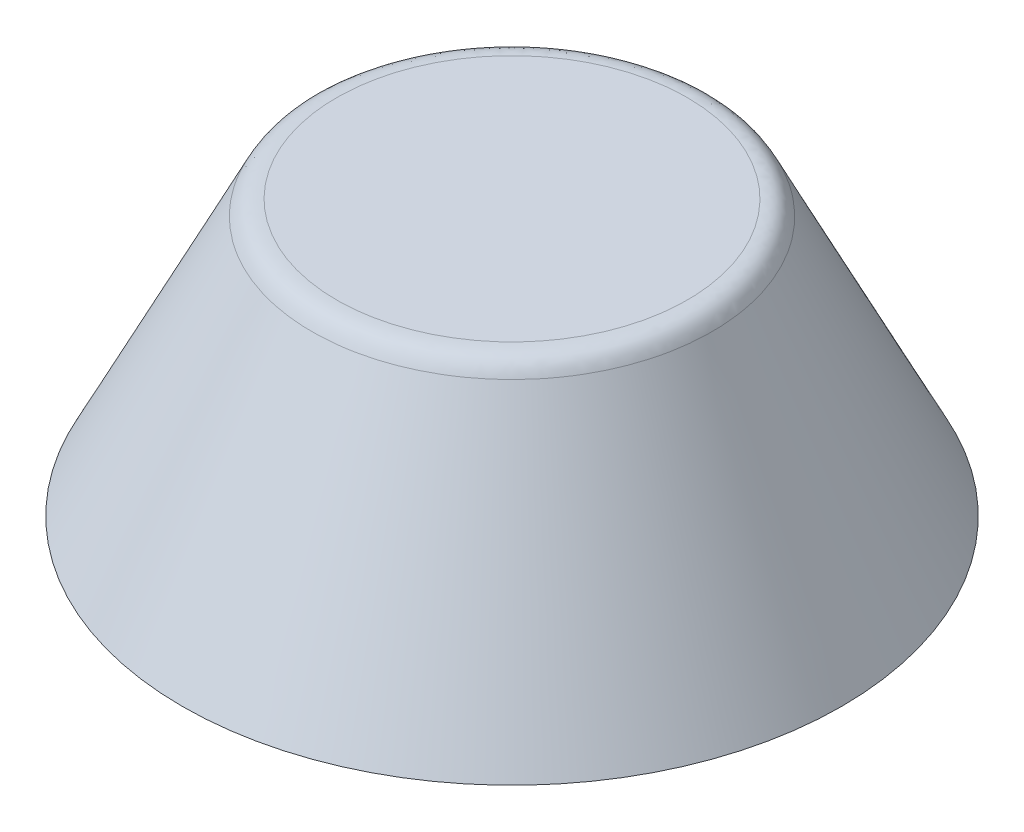
ISO-10303-21;
HEADER;
FILE_DESCRIPTION(('STEP AP214'),'2;1');
FILE_NAME('part.step','',(''),(''),'','','');
FILE_SCHEMA(('AUTOMOTIVE_DESIGN { 1 0 10303 214 1 1 1 1 }'));
ENDSEC;
DATA;
#1=APPLICATION_CONTEXT('core data for automotive mechanical design processes');
#2=APPLICATION_PROTOCOL_DEFINITION('international standard','automotive_design',2000,#1);
#3=PRODUCT_CONTEXT('',#1,'mechanical');
#4=PRODUCT('Part','Part','',(#3));
#5=PRODUCT_RELATED_PRODUCT_CATEGORY('part','',(#4));
#6=PRODUCT_DEFINITION_FORMATION('','',#4);
#7=PRODUCT_DEFINITION_CONTEXT('part definition',#1,'design');
#8=PRODUCT_DEFINITION('design','',#6,#7);
#9=PRODUCT_DEFINITION_SHAPE('','',#8);
#10=(LENGTH_UNIT() NAMED_UNIT(*) SI_UNIT(.MILLI.,.METRE.));
#11=(NAMED_UNIT(*) PLANE_ANGLE_UNIT() SI_UNIT($,.RADIAN.));
#12=(NAMED_UNIT(*) SI_UNIT($,.STERADIAN.) SOLID_ANGLE_UNIT());
#13=UNCERTAINTY_MEASURE_WITH_UNIT(LENGTH_MEASURE(1.E-05),#10,'distance_accuracy_value','');
#14=(GEOMETRIC_REPRESENTATION_CONTEXT(3) GLOBAL_UNCERTAINTY_ASSIGNED_CONTEXT((#13)) GLOBAL_UNIT_ASSIGNED_CONTEXT((#10,
#11,#12)) REPRESENTATION_CONTEXT('',''));
#15=CARTESIAN_POINT('',(0.,0.,0.));
#16=DIRECTION('',(0.,0.,1.));
#17=DIRECTION('',(1.,0.,0.));
#18=AXIS2_PLACEMENT_3D('',#15,#16,#17);
#19=CARTESIAN_POINT('',(0.,0.,0.));
#20=DIRECTION('',(0.,-1.,0.));
#21=DIRECTION('',(0.,0.,-1.));
#22=AXIS2_PLACEMENT_3D('',#19,#20,#21);
#23=CYLINDRICAL_SURFACE('',#22,2.75);
#24=CARTESIAN_POINT('',(0.,0.5,-2.75));
#25=CARTESIAN_POINT('',(-0.359925717630412,0.5,-2.75));
#26=CARTESIAN_POINT('',(-1.07977715289124,0.5,-2.60681264685063));
#27=CARTESIAN_POINT('',(-1.99516802245905,0.5,-1.99516802245904));
#28=CARTESIAN_POINT('',(-2.60681264685063,0.5,-1.07977715289123));
#29=CARTESIAN_POINT('',(-2.82159367657469,0.5,0.));
#30=CARTESIAN_POINT('',(-2.60681264685062,0.5,1.07977715289124));
#31=CARTESIAN_POINT('',(-1.99516802245905,0.5,1.99516802245904));
#32=CARTESIAN_POINT('',(-1.07977715289123,0.5,2.60681264685063));
#33=CARTESIAN_POINT('',(0.,0.5,2.82159367657469));
#34=CARTESIAN_POINT('',(1.07977715289124,0.5,2.60681264685062));
#35=CARTESIAN_POINT('',(1.99516802245904,0.5,1.99516802245904));
#36=CARTESIAN_POINT('',(2.60681264685063,0.5,1.07977715289124));
#37=CARTESIAN_POINT('',(2.82159367657469,0.5,0.));
#38=CARTESIAN_POINT('',(2.60681264685063,0.5,-1.07977715289123));
#39=CARTESIAN_POINT('',(1.99516802245904,0.5,-1.99516802245904));
#40=CARTESIAN_POINT('',(1.07977715289123,0.5,-2.60681264685063));
#41=CARTESIAN_POINT('',(0.359925717630412,0.5,-2.75));
#42=CARTESIAN_POINT('',(0.,0.5,-2.75));
#43=B_SPLINE_CURVE_WITH_KNOTS('',3,(#24,#25,#26,#27,#28,#29,#30,#31,#32,#33,#34,#35,#36,#37,#38,
#39,#40,#41,#42),.UNSPECIFIED.,.T.,.F.,(4,1,1,1,1,1,1,1,1,1,1,1,1,1,1,1,4),(0.,
0.392699081698724,0.785398163397448,1.17809724509617,1.5707963267949,1.96349540849362,
2.35619449019235,2.74889357189107,3.14159265358979,3.53429173528852,3.92699081698724,
4.31968989868597,4.71238898038469,5.10508806208341,5.49778714378214,5.89048622548086,
6.28318530717959),.UNSPECIFIED.);
#44=CARTESIAN_POINT('',(0.,0.5,-2.75));
#45=VERTEX_POINT('',#44);
#46=EDGE_CURVE('E59',#45,#45,#43,.F.);
#47=ORIENTED_EDGE('',*,*,#46,.T.);
#48=EDGE_LOOP('',(#47));
#49=FACE_BOUND('',#48,.T.);
#50=CARTESIAN_POINT('',(0.,4.,0.));
#51=DIRECTION('',(0.,-1.,0.));
#52=DIRECTION('',(0.,0.,-1.));
#53=AXIS2_PLACEMENT_3D('',#50,#51,#52);
#54=CIRCLE('',#53,2.75);
#55=CARTESIAN_POINT('',(0.,4.,-2.75));
#56=VERTEX_POINT('',#55);
#57=EDGE_CURVE('E74',#56,#56,#54,.T.);
#58=ORIENTED_EDGE('',*,*,#57,.F.);
#59=EDGE_LOOP('',(#58));
#60=FACE_BOUND('',#59,.T.);
#61=ADVANCED_FACE('F46',(#49,#60),#23,.F.);
#62=CARTESIAN_POINT('',(0.,4.,0.));
#63=DIRECTION('',(0.,-1.,0.));
#64=DIRECTION('',(0.,0.,-1.));
#65=AXIS2_PLACEMENT_3D('',#62,#63,#64);
#66=PLANE('',#65);
#67=ORIENTED_EDGE('',*,*,#57,.T.);
#68=EDGE_LOOP('',(#67));
#69=FACE_BOUND('',#68,.T.);
#70=ADVANCED_FACE('F106',(#69),#66,.T.);
#71=CARTESIAN_POINT('',(0.,5.,0.));
#72=DIRECTION('',(0.,-1.,0.));
#73=DIRECTION('',(0.,0.,-1.));
#74=AXIS2_PLACEMENT_3D('',#71,#72,#73);
#75=PLANE('',#74);
#76=CARTESIAN_POINT('',(0.,5.,-3.19098300562506));
#77=CARTESIAN_POINT('',(0.417642490271289,5.,-3.19098300562506));
#78=CARTESIAN_POINT('',(1.25292747081387,5.,-3.02483449270866));
#79=CARTESIAN_POINT('',(2.31510809201213,5.,-2.31510809201213));
#80=CARTESIAN_POINT('',(3.02483449270866,5.,-1.25292747081386));
#81=CARTESIAN_POINT('',(3.27405726208325,5.,0.));
#82=CARTESIAN_POINT('',(3.02483449270866,5.,1.25292747081387));
#83=CARTESIAN_POINT('',(2.31510809201212,5.,2.31510809201213));
#84=CARTESIAN_POINT('',(1.25292747081388,5.,3.02483449270866));
#85=CARTESIAN_POINT('',(0.,5.,3.27405726208325));
#86=CARTESIAN_POINT('',(-1.25292747081386,5.,3.02483449270866));
#87=CARTESIAN_POINT('',(-2.31510809201213,5.,2.31510809201212));
#88=CARTESIAN_POINT('',(-3.02483449270866,5.,1.25292747081388));
#89=CARTESIAN_POINT('',(-3.27405726208325,5.,0.));
#90=CARTESIAN_POINT('',(-3.02483449270866,5.,-1.25292747081386));
#91=CARTESIAN_POINT('',(-2.31510809201214,5.,-2.31510809201212));
#92=CARTESIAN_POINT('',(-1.25292747081387,5.,-3.02483449270866));
#93=CARTESIAN_POINT('',(-0.417642490271289,5.,-3.19098300562506));
#94=CARTESIAN_POINT('',(0.,5.,-3.19098300562506));
#95=B_SPLINE_CURVE_WITH_KNOTS('',3,(#76,#77,#78,#79,#80,#81,#82,#83,#84,#85,#86,#87,#88,#89,#90,
#91,#92,#93,#94),.UNSPECIFIED.,.T.,.F.,(4,1,1,1,1,1,1,1,1,1,1,1,1,1,1,1,4),(0.,
0.392699081698724,0.785398163397448,1.17809724509617,1.5707963267949,1.96349540849362,
2.35619449019234,2.74889357189107,3.14159265358979,3.53429173528852,3.92699081698724,
4.31968989868597,4.71238898038469,5.10508806208341,5.49778714378214,5.89048622548086,
6.28318530717959),.UNSPECIFIED.);
#96=CARTESIAN_POINT('',(0.,5.,-3.19098300562505));
#97=VERTEX_POINT('',#96);
#98=EDGE_CURVE('E64',#97,#97,#95,.F.);
#99=ORIENTED_EDGE('',*,*,#98,.T.);
#100=EDGE_LOOP('',(#99));
#101=FACE_BOUND('',#100,.T.);
#102=ADVANCED_FACE('F101',(#101),#75,.F.);
#103=CARTESIAN_POINT('',(0.,5.,0.));
#104=DIRECTION('',(0.,-1.,0.));
#105=DIRECTION('',(0.,0.,-1.));
#106=AXIS2_PLACEMENT_3D('',#103,#104,#105);
#107=CONICAL_SURFACE('',#106,3.5,0.463647609000806);
#108=CARTESIAN_POINT('',(0.,4.72360679774998,-3.63819660112501));
#109=CARTESIAN_POINT('',(-0.476174735469252,4.72360679774998,-3.63819660112501));
#110=CARTESIAN_POINT('',(-1.42852420640776,4.72360679774998,-3.44876251328787));
#111=CARTESIAN_POINT('',(-2.63956855199412,4.72360679774998,-2.6395685519941));
#112=CARTESIAN_POINT('',(-3.44876251328787,4.72360679774998,-1.42852420640775));
#113=CARTESIAN_POINT('',(-3.73291364504358,4.72360679774998,0.));
#114=CARTESIAN_POINT('',(-3.44876251328786,4.72360679774998,1.42852420640777));
#115=CARTESIAN_POINT('',(-2.63956855199412,4.72360679774998,2.6395685519941));
#116=CARTESIAN_POINT('',(-1.42852420640775,4.72360679774998,3.44876251328787));
#117=CARTESIAN_POINT('',(0.,4.72360679774998,3.73291364504358));
#118=CARTESIAN_POINT('',(1.42852420640777,4.72360679774998,3.44876251328787));
#119=CARTESIAN_POINT('',(2.6395685519941,4.72360679774998,2.63956855199411));
#120=CARTESIAN_POINT('',(3.44876251328787,4.72360679774998,1.42852420640776));
#121=CARTESIAN_POINT('',(3.73291364504358,4.72360679774998,0.));
#122=CARTESIAN_POINT('',(3.44876251328787,4.72360679774998,-1.42852420640775));
#123=CARTESIAN_POINT('',(2.63956855199411,4.72360679774998,-2.63956855199411));
#124=CARTESIAN_POINT('',(1.42852420640776,4.72360679774998,-3.44876251328787));
#125=CARTESIAN_POINT('',(0.476174735469253,4.72360679774998,-3.63819660112501));
#126=CARTESIAN_POINT('',(0.,4.72360679774998,-3.63819660112501));
#127=B_SPLINE_CURVE_WITH_KNOTS('',3,(#108,#109,#110,#111,#112,#113,#114,#115,#116,#117,#118,
#119,#120,#121,#122,#123,#124,#125,#126),.UNSPECIFIED.,.T.,.F.,(4,1,1,1,1,1,1,1,1,1,1,1,1,1,1,1,
4),(0.,0.392699081698724,0.785398163397448,1.17809724509617,1.5707963267949,1.96349540849362,
2.35619449019235,2.74889357189107,3.14159265358979,3.53429173528852,3.92699081698724,
4.31968989868597,4.71238898038469,5.10508806208341,5.49778714378214,5.89048622548086,
6.28318530717959),.UNSPECIFIED.);
#128=CARTESIAN_POINT('',(0.,4.72360679774998,-3.63819660112501));
#129=VERTEX_POINT('',#128);
#130=EDGE_CURVE('E69',#129,#129,#127,.F.);
#131=ORIENTED_EDGE('',*,*,#130,.T.);
#132=EDGE_LOOP('',(#131));
#133=FACE_BOUND('',#132,.T.);
#134=CARTESIAN_POINT('',(0.,0.,0.));
#135=DIRECTION('',(0.,-1.,0.));
#136=DIRECTION('',(0.,0.,-1.));
#137=AXIS2_PLACEMENT_3D('',#134,#135,#136);
#138=CIRCLE('',#137,6.);
#139=CARTESIAN_POINT('',(0.,0.,-6.));
#140=VERTEX_POINT('',#139);
#141=EDGE_CURVE('E79',#140,#140,#138,.T.);
#142=ORIENTED_EDGE('',*,*,#141,.F.);
#143=EDGE_LOOP('',(#142));
#144=FACE_BOUND('',#143,.T.);
#145=ADVANCED_FACE('F90',(#133,#144),#107,.T.);
#146=CARTESIAN_POINT('',(2.75,0.,0.));
#147=DIRECTION('',(0.,-1.,0.));
#148=DIRECTION('',(0.,0.,-1.));
#149=AXIS2_PLACEMENT_3D('',#146,#147,#148);
#150=PLANE('',#149);
#151=CARTESIAN_POINT('',(0.,0.,-3.25));
#152=CARTESIAN_POINT('',(0.425366757199578,0.,-3.25));
#153=CARTESIAN_POINT('',(1.27610027159873,0.,-3.08077858264165));
#154=CARTESIAN_POINT('',(2.35792584472432,0.,-2.35792584472432));
#155=CARTESIAN_POINT('',(3.08077858264165,0.,-1.27610027159873));
#156=CARTESIAN_POINT('',(3.33461070867917,0.,0.));
#157=CARTESIAN_POINT('',(3.08077858264165,0.,1.27610027159873));
#158=CARTESIAN_POINT('',(2.35792584472432,0.,2.35792584472433));
#159=CARTESIAN_POINT('',(1.27610027159874,0.,3.08077858264165));
#160=CARTESIAN_POINT('',(0.,0.,3.33461070867917));
#161=CARTESIAN_POINT('',(-1.27610027159872,0.,3.08077858264165));
#162=CARTESIAN_POINT('',(-2.35792584472433,0.,2.35792584472432));
#163=CARTESIAN_POINT('',(-3.08077858264164,0.,1.27610027159874));
#164=CARTESIAN_POINT('',(-3.33461070867918,0.,0.));
#165=CARTESIAN_POINT('',(-3.08077858264165,0.,-1.27610027159872));
#166=CARTESIAN_POINT('',(-2.35792584472433,0.,-2.35792584472432));
#167=CARTESIAN_POINT('',(-1.27610027159873,0.,-3.08077858264165));
#168=CARTESIAN_POINT('',(-0.425366757199578,0.,-3.25));
#169=CARTESIAN_POINT('',(0.,0.,-3.25));
#170=B_SPLINE_CURVE_WITH_KNOTS('',3,(#151,#152,#153,#154,#155,#156,#157,#158,#159,#160,#161,
#162,#163,#164,#165,#166,#167,#168,#169),.UNSPECIFIED.,.T.,.F.,(4,1,1,1,1,1,1,1,1,1,1,1,1,1,1,1,
4),(0.,0.392699081698724,0.785398163397448,1.17809724509617,1.5707963267949,1.96349540849362,
2.35619449019234,2.74889357189107,3.14159265358979,3.53429173528852,3.92699081698724,
4.31968989868597,4.71238898038469,5.10508806208341,5.49778714378214,5.89048622548086,
6.28318530717959),.UNSPECIFIED.);
#171=CARTESIAN_POINT('',(0.,0.,-3.25));
#172=VERTEX_POINT('',#171);
#173=EDGE_CURVE('E11',#172,#172,#170,.F.);
#174=ORIENTED_EDGE('',*,*,#173,.T.);
#175=EDGE_LOOP('',(#174));
#176=FACE_BOUND('',#175,.T.);
#177=ORIENTED_EDGE('',*,*,#141,.T.);
#178=EDGE_LOOP('',(#177));
#179=FACE_BOUND('',#178,.T.);
#180=ADVANCED_FACE('F100',(#176,#179),#150,.T.);
#181=CARTESIAN_POINT('',(0.,4.72360679774998,-3.63819660112501));
#182=CARTESIAN_POINT('',(0.476174735469253,4.72360679774998,-3.63819660112501));
#183=CARTESIAN_POINT('',(1.42852420640776,4.72360679774998,-3.44876251328787));
#184=CARTESIAN_POINT('',(2.63956855199411,4.72360679774998,-2.63956855199411));
#185=CARTESIAN_POINT('',(3.44876251328787,4.72360679774998,-1.42852420640775));
#186=CARTESIAN_POINT('',(3.73291364504358,4.72360679774998,0.));
#187=CARTESIAN_POINT('',(3.44876251328787,4.72360679774998,1.42852420640776));
#188=CARTESIAN_POINT('',(2.6395685519941,4.72360679774998,2.63956855199411));
#189=CARTESIAN_POINT('',(1.42852420640777,4.72360679774998,3.44876251328787));
#190=CARTESIAN_POINT('',(0.,4.72360679774998,3.73291364504358));
#191=CARTESIAN_POINT('',(-1.42852420640775,4.72360679774998,3.44876251328787));
#192=CARTESIAN_POINT('',(-2.63956855199412,4.72360679774998,2.6395685519941));
#193=CARTESIAN_POINT('',(-3.44876251328786,4.72360679774998,1.42852420640777));
#194=CARTESIAN_POINT('',(-3.73291364504358,4.72360679774998,0.));
#195=CARTESIAN_POINT('',(-3.44876251328787,4.72360679774998,-1.42852420640775));
#196=CARTESIAN_POINT('',(-2.63956855199412,4.72360679774998,-2.6395685519941));
#197=CARTESIAN_POINT('',(-1.42852420640776,4.72360679774998,-3.44876251328787));
#198=CARTESIAN_POINT('',(-0.476174735469252,4.72360679774998,-3.63819660112501));
#199=CARTESIAN_POINT('',(0.,4.72360679774998,-3.63819660112501));
#200=CARTESIAN_POINT('',(0.,4.7729211903042,-3.6135394048479));
#201=CARTESIAN_POINT('',(0.472947550354783,4.7729211903042,-3.6135394048479));
#202=CARTESIAN_POINT('',(1.41884265106435,4.7729211903042,-3.42538917107294));
#203=CARTESIAN_POINT('',(2.62167937034481,4.7729211903042,-2.62167937034481));
#204=CARTESIAN_POINT('',(3.42538917107294,4.7729211903042,-1.41884265106434));
#205=CARTESIAN_POINT('',(3.70761452173538,4.77292119030419,0.));
#206=CARTESIAN_POINT('',(3.42538917107295,4.7729211903042,1.41884265106435));
#207=CARTESIAN_POINT('',(2.6216793703448,4.77292119030419,2.62167937034481));
#208=CARTESIAN_POINT('',(1.41884265106436,4.7729211903042,3.42538917107294));
#209=CARTESIAN_POINT('',(0.,4.77292119030419,3.70761452173538));
#210=CARTESIAN_POINT('',(-1.41884265106434,4.7729211903042,3.42538917107295));
#211=CARTESIAN_POINT('',(-2.62167937034481,4.7729211903042,2.6216793703448));
#212=CARTESIAN_POINT('',(-3.42538917107294,4.77292119030419,1.41884265106436));
#213=CARTESIAN_POINT('',(-3.70761452173538,4.7729211903042,0.));
#214=CARTESIAN_POINT('',(-3.42538917107294,4.7729211903042,-1.41884265106434));
#215=CARTESIAN_POINT('',(-2.62167937034482,4.7729211903042,-2.6216793703448));
#216=CARTESIAN_POINT('',(-1.41884265106435,4.7729211903042,-3.42538917107294));
#217=CARTESIAN_POINT('',(-0.472947550354783,4.7729211903042,-3.6135394048479));
#218=CARTESIAN_POINT('',(0.,4.7729211903042,-3.6135394048479));
#219=CARTESIAN_POINT('',(0.,4.82223558285841,-3.5888822085708));
#220=CARTESIAN_POINT('',(0.469720365240313,4.82223558285841,-3.5888822085708));
#221=CARTESIAN_POINT('',(1.40916109572094,4.82223558285841,-3.40201582885802));
#222=CARTESIAN_POINT('',(2.60379018869551,4.82223558285841,-2.60379018869551));
#223=CARTESIAN_POINT('',(3.40201582885802,4.82223558285841,-1.40916109572093));
#224=CARTESIAN_POINT('',(3.68231539842718,4.82223558285841,0.));
#225=CARTESIAN_POINT('',(3.40201582885802,4.82223558285841,1.40916109572094));
#226=CARTESIAN_POINT('',(2.6037901886955,4.82223558285841,2.60379018869551));
#227=CARTESIAN_POINT('',(1.40916109572095,4.82223558285841,3.40201582885802));
#228=CARTESIAN_POINT('',(0.,4.82223558285841,3.68231539842718));
#229=CARTESIAN_POINT('',(-1.40916109572093,4.82223558285841,3.40201582885803));
#230=CARTESIAN_POINT('',(-2.60379018869551,4.82223558285841,2.6037901886955));
#231=CARTESIAN_POINT('',(-3.40201582885802,4.82223558285841,1.40916109572095));
#232=CARTESIAN_POINT('',(-3.68231539842718,4.82223558285841,0.));
#233=CARTESIAN_POINT('',(-3.40201582885802,4.82223558285841,-1.40916109572093));
#234=CARTESIAN_POINT('',(-2.60379018869551,4.82223558285841,-2.6037901886955));
#235=CARTESIAN_POINT('',(-1.40916109572094,4.82223558285841,-3.40201582885802));
#236=CARTESIAN_POINT('',(-0.469720365240313,4.82223558285841,-3.5888822085708));
#237=CARTESIAN_POINT('',(0.,4.82223558285841,-3.5888822085708));
#238=CARTESIAN_POINT('',(0.,4.92532540417602,-3.52009744846949));
#239=CARTESIAN_POINT('',(0.460717672825223,4.92532540417602,-3.52009744846949));
#240=CARTESIAN_POINT('',(1.38215301847567,4.92532540417602,-3.33681256247887));
#241=CARTESIAN_POINT('',(2.55388576913673,4.92532540417602,-2.55388576913673));
#242=CARTESIAN_POINT('',(3.33681256247887,4.92532540417602,-1.38215301847566));
#243=CARTESIAN_POINT('',(3.6117398914648,4.92532540417602,0.));
#244=CARTESIAN_POINT('',(3.33681256247887,4.92532540417602,1.38215301847567));
#245=CARTESIAN_POINT('',(2.55388576913672,4.92532540417602,2.55388576913673));
#246=CARTESIAN_POINT('',(1.38215301847568,4.92532540417602,3.33681256247886));
#247=CARTESIAN_POINT('',(0.,4.92532540417602,3.6117398914648));
#248=CARTESIAN_POINT('',(-1.38215301847566,4.92532540417602,3.33681256247887));
#249=CARTESIAN_POINT('',(-2.55388576913673,4.92532540417602,2.55388576913672));
#250=CARTESIAN_POINT('',(-3.33681256247886,4.92532540417602,1.38215301847568));
#251=CARTESIAN_POINT('',(-3.6117398914648,4.92532540417602,0.));
#252=CARTESIAN_POINT('',(-3.33681256247887,4.92532540417602,-1.38215301847566));
#253=CARTESIAN_POINT('',(-2.55388576913674,4.92532540417603,-2.55388576913672));
#254=CARTESIAN_POINT('',(-1.38215301847567,4.92532540417602,-3.33681256247887));
#255=CARTESIAN_POINT('',(-0.460717672825223,4.92532540417602,-3.52009744846949));
#256=CARTESIAN_POINT('',(0.,4.92532540417602,-3.52009744846949));
#257=CARTESIAN_POINT('',(0.,4.98458020988989,-3.42422115882769));
#258=CARTESIAN_POINT('',(0.448169184696835,4.98458020988989,-3.42422115882769));
#259=CARTESIAN_POINT('',(1.3445075540905,4.98458020988989,-3.24592837179837));
#260=CARTESIAN_POINT('',(2.48432602106206,4.98458020988989,-2.48432602106206));
#261=CARTESIAN_POINT('',(3.24592837179837,4.98458020988988,-1.3445075540905));
#262=CARTESIAN_POINT('',(3.51336755234234,4.98458020988989,0.));
#263=CARTESIAN_POINT('',(3.24592837179837,4.98458020988989,1.3445075540905));
#264=CARTESIAN_POINT('',(2.48432602106205,4.98458020988988,2.48432602106206));
#265=CARTESIAN_POINT('',(1.34450755409051,4.98458020988989,3.24592837179837));
#266=CARTESIAN_POINT('',(0.,4.98458020988988,3.51336755234234));
#267=CARTESIAN_POINT('',(-1.34450755409049,4.98458020988989,3.24592837179838));
#268=CARTESIAN_POINT('',(-2.48432602106206,4.98458020988988,2.48432602106205));
#269=CARTESIAN_POINT('',(-3.24592837179837,4.98458020988989,1.34450755409051));
#270=CARTESIAN_POINT('',(-3.51336755234235,4.98458020988989,0.));
#271=CARTESIAN_POINT('',(-3.24592837179837,4.98458020988989,-1.34450755409049));
#272=CARTESIAN_POINT('',(-2.48432602106207,4.98458020988989,-2.48432602106205));
#273=CARTESIAN_POINT('',(-1.34450755409051,4.98458020988989,-3.24592837179837));
#274=CARTESIAN_POINT('',(-0.448169184696835,4.98458020988989,-3.42422115882769));
#275=CARTESIAN_POINT('',(0.,4.98458020988989,-3.42422115882769));
#276=CARTESIAN_POINT('',(0.,5.,-3.30125333964539));
#277=CARTESIAN_POINT('',(0.432074900855149,5.,-3.30125333964539));
#278=CARTESIAN_POINT('',(1.29622470256545,5.,-3.12936325681653));
#279=CARTESIAN_POINT('',(2.39511094447149,5.,-2.39511094447149));
#280=CARTESIAN_POINT('',(3.12936325681653,5.,-1.29622470256544));
#281=CARTESIAN_POINT('',(3.38719838105982,5.,0.));
#282=CARTESIAN_POINT('',(3.12936325681653,5.,1.29622470256545));
#283=CARTESIAN_POINT('',(2.39511094447149,5.,2.39511094447149));
#284=CARTESIAN_POINT('',(1.29622470256546,5.,3.12936325681653));
#285=CARTESIAN_POINT('',(0.,5.,3.38719838105981));
#286=CARTESIAN_POINT('',(-1.29622470256544,5.,3.12936325681654));
#287=CARTESIAN_POINT('',(-2.3951109444715,5.,2.39511094447149));
#288=CARTESIAN_POINT('',(-3.12936325681653,5.,1.29622470256545));
#289=CARTESIAN_POINT('',(-3.38719838105982,5.,0.));
#290=CARTESIAN_POINT('',(-3.12936325681653,5.,-1.29622470256544));
#291=CARTESIAN_POINT('',(-2.3951109444715,5.,-2.39511094447148));
#292=CARTESIAN_POINT('',(-1.29622470256545,5.,-3.12936325681653));
#293=CARTESIAN_POINT('',(-0.432074900855149,5.,-3.30125333964539));
#294=CARTESIAN_POINT('',(0.,5.,-3.30125333964539));
#295=CARTESIAN_POINT('',(0.,5.,-3.24611817263522));
#296=CARTESIAN_POINT('',(0.424858695563219,5.,-3.24611817263522));
#297=CARTESIAN_POINT('',(1.27457608668966,5.,-3.07709887476259));
#298=CARTESIAN_POINT('',(2.35510951824181,5.,-2.35510951824181));
#299=CARTESIAN_POINT('',(3.07709887476259,5.,-1.27457608668965));
#300=CARTESIAN_POINT('',(3.33062782157153,5.,0.));
#301=CARTESIAN_POINT('',(3.0770988747626,5.,1.27457608668966));
#302=CARTESIAN_POINT('',(2.3551095182418,5.,2.35510951824181));
#303=CARTESIAN_POINT('',(1.27457608668967,5.,3.07709887476259));
#304=CARTESIAN_POINT('',(0.,5.,3.33062782157153));
#305=CARTESIAN_POINT('',(-1.27457608668965,5.,3.0770988747626));
#306=CARTESIAN_POINT('',(-2.35510951824182,5.,2.3551095182418));
#307=CARTESIAN_POINT('',(-3.07709887476259,5.,1.27457608668967));
#308=CARTESIAN_POINT('',(-3.33062782157154,5.,0.));
#309=CARTESIAN_POINT('',(-3.0770988747626,5.,-1.27457608668965));
#310=CARTESIAN_POINT('',(-2.35510951824182,5.,-2.35510951824181));
#311=CARTESIAN_POINT('',(-1.27457608668966,5.,-3.07709887476259));
#312=CARTESIAN_POINT('',(-0.424858695563219,5.,-3.24611817263522));
#313=CARTESIAN_POINT('',(0.,5.,-3.24611817263522));
#314=CARTESIAN_POINT('',(0.,5.,-3.19098300562505));
#315=CARTESIAN_POINT('',(0.417642490271289,5.,-3.19098300562505));
#316=CARTESIAN_POINT('',(1.25292747081387,5.,-3.02483449270866));
#317=CARTESIAN_POINT('',(2.31510809201213,5.,-2.31510809201213));
#318=CARTESIAN_POINT('',(3.02483449270866,5.,-1.25292747081386));
#319=CARTESIAN_POINT('',(3.27405726208325,5.,0.));
#320=CARTESIAN_POINT('',(3.02483449270866,5.,1.25292747081387));
#321=CARTESIAN_POINT('',(2.31510809201212,5.,2.31510809201213));
#322=CARTESIAN_POINT('',(1.25292747081388,5.,3.02483449270865));
#323=CARTESIAN_POINT('',(0.,5.,3.27405726208325));
#324=CARTESIAN_POINT('',(-1.25292747081386,5.,3.02483449270866));
#325=CARTESIAN_POINT('',(-2.31510809201213,5.,2.31510809201212));
#326=CARTESIAN_POINT('',(-3.02483449270865,5.,1.25292747081388));
#327=CARTESIAN_POINT('',(-3.27405726208325,5.,0.));
#328=CARTESIAN_POINT('',(-3.02483449270866,5.,-1.25292747081386));
#329=CARTESIAN_POINT('',(-2.31510809201214,5.,-2.31510809201212));
#330=CARTESIAN_POINT('',(-1.25292747081387,5.,-3.02483449270866));
#331=CARTESIAN_POINT('',(-0.417642490271289,5.,-3.19098300562505));
#332=CARTESIAN_POINT('',(0.,5.,-3.19098300562505));
#333=B_SPLINE_SURFACE_WITH_KNOTS('',5,3,((#181,#182,#183,#184,#185,#186,#187,#188,#189,#190,
#191,#192,#193,#194,#195,#196,#197,#198,#199),(#200,#201,#202,#203,#204,#205,#206,#207,#208,
#209,#210,#211,#212,#213,#214,#215,#216,#217,#218),(#219,#220,#221,#222,#223,#224,#225,#226,
#227,#228,#229,#230,#231,#232,#233,#234,#235,#236,#237),(#238,#239,#240,#241,#242,#243,#244,
#245,#246,#247,#248,#249,#250,#251,#252,#253,#254,#255,#256),(#257,#258,#259,#260,#261,#262,
#263,#264,#265,#266,#267,#268,#269,#270,#271,#272,#273,#274,#275),(#276,#277,#278,#279,#280,
#281,#282,#283,#284,#285,#286,#287,#288,#289,#290,#291,#292,#293,#294),(#295,#296,#297,#298,
#299,#300,#301,#302,#303,#304,#305,#306,#307,#308,#309,#310,#311,#312,#313),(#314,#315,#316,
#317,#318,#319,#320,#321,#322,#323,#324,#325,#326,#327,#328,#329,#330,#331,#332)),.UNSPECIFIED.,
.F.,.T.,.F.,(6,2,6),(4,1,1,1,1,1,1,1,1,1,1,1,1,1,1,1,4),(0.,0.5,1.),(0.,0.392699081698724,
0.785398163397448,1.17809724509617,1.5707963267949,1.96349540849362,2.35619449019234,
2.74889357189107,3.14159265358979,3.53429173528852,3.92699081698724,4.31968989868597,
4.71238898038469,5.10508806208341,5.49778714378214,5.89048622548086,6.28318530717959),.UNSPECIFIED.);
#334=ORIENTED_EDGE('',*,*,#98,.F.);
#335=EDGE_LOOP('',(#334));
#336=FACE_BOUND('',#335,.T.);
#337=ORIENTED_EDGE('',*,*,#130,.F.);
#338=EDGE_LOOP('',(#337));
#339=FACE_BOUND('',#338,.T.);
#340=ADVANCED_FACE('F123',(#336,#339),#333,.T.);
#341=CARTESIAN_POINT('',(0.,0.5,-2.75));
#342=CARTESIAN_POINT('',(0.359925717630412,0.5,-2.75));
#343=CARTESIAN_POINT('',(1.07977715289123,0.5,-2.60681264685063));
#344=CARTESIAN_POINT('',(1.99516802245904,0.5,-1.99516802245904));
#345=CARTESIAN_POINT('',(2.60681264685063,0.5,-1.07977715289123));
#346=CARTESIAN_POINT('',(2.82159367657469,0.5,0.));
#347=CARTESIAN_POINT('',(2.60681264685063,0.5,1.07977715289124));
#348=CARTESIAN_POINT('',(1.99516802245904,0.5,1.99516802245904));
#349=CARTESIAN_POINT('',(1.07977715289124,0.5,2.60681264685062));
#350=CARTESIAN_POINT('',(0.,0.5,2.82159367657469));
#351=CARTESIAN_POINT('',(-1.07977715289123,0.5,2.60681264685063));
#352=CARTESIAN_POINT('',(-1.99516802245905,0.5,1.99516802245904));
#353=CARTESIAN_POINT('',(-2.60681264685062,0.5,1.07977715289124));
#354=CARTESIAN_POINT('',(-2.82159367657469,0.5,0.));
#355=CARTESIAN_POINT('',(-2.60681264685063,0.5,-1.07977715289123));
#356=CARTESIAN_POINT('',(-1.99516802245905,0.5,-1.99516802245904));
#357=CARTESIAN_POINT('',(-1.07977715289124,0.5,-2.60681264685063));
#358=CARTESIAN_POINT('',(-0.359925717630412,0.5,-2.75));
#359=CARTESIAN_POINT('',(0.,0.5,-2.75));
#360=CARTESIAN_POINT('',(0.,0.415900974233027,-2.75));
#361=CARTESIAN_POINT('',(0.359925717630412,0.415900974233027,-2.75));
#362=CARTESIAN_POINT('',(1.07977715289123,0.415900974233027,-2.60681264685063));
#363=CARTESIAN_POINT('',(1.99516802245904,0.415900974233026,-1.99516802245904));
#364=CARTESIAN_POINT('',(2.60681264685063,0.415900974233027,-1.07977715289123));
#365=CARTESIAN_POINT('',(2.82159367657469,0.415900974233026,0.));
#366=CARTESIAN_POINT('',(2.60681264685063,0.415900974233027,1.07977715289124));
#367=CARTESIAN_POINT('',(1.99516802245904,0.415900974233026,1.99516802245904));
#368=CARTESIAN_POINT('',(1.07977715289124,0.415900974233026,2.60681264685062));
#369=CARTESIAN_POINT('',(0.,0.415900974233027,2.82159367657469));
#370=CARTESIAN_POINT('',(-1.07977715289123,0.415900974233026,2.60681264685063));
#371=CARTESIAN_POINT('',(-1.99516802245905,0.415900974233027,1.99516802245904));
#372=CARTESIAN_POINT('',(-2.60681264685062,0.415900974233026,1.07977715289124));
#373=CARTESIAN_POINT('',(-2.82159367657469,0.415900974233027,0.));
#374=CARTESIAN_POINT('',(-2.60681264685063,0.415900974233026,-1.07977715289123));
#375=CARTESIAN_POINT('',(-1.99516802245905,0.415900974233027,-1.99516802245904));
#376=CARTESIAN_POINT('',(-1.07977715289124,0.415900974233026,-2.60681264685063));
#377=CARTESIAN_POINT('',(-0.359925717630412,0.415900974233026,-2.75));
#378=CARTESIAN_POINT('',(0.,0.415900974233027,-2.75));
#379=CARTESIAN_POINT('',(0.,0.331801948466053,-2.75));
#380=CARTESIAN_POINT('',(0.359925717630412,0.331801948466053,-2.75));
#381=CARTESIAN_POINT('',(1.07977715289123,0.331801948466054,-2.60681264685063));
#382=CARTESIAN_POINT('',(1.99516802245904,0.331801948466054,-1.99516802245904));
#383=CARTESIAN_POINT('',(2.60681264685063,0.331801948466053,-1.07977715289123));
#384=CARTESIAN_POINT('',(2.82159367657469,0.331801948466053,0.));
#385=CARTESIAN_POINT('',(2.60681264685063,0.331801948466053,1.07977715289124));
#386=CARTESIAN_POINT('',(1.99516802245904,0.331801948466053,1.99516802245904));
#387=CARTESIAN_POINT('',(1.07977715289124,0.331801948466053,2.60681264685062));
#388=CARTESIAN_POINT('',(0.,0.331801948466054,2.82159367657469));
#389=CARTESIAN_POINT('',(-1.07977715289123,0.331801948466053,2.60681264685063));
#390=CARTESIAN_POINT('',(-1.99516802245905,0.331801948466054,1.99516802245904));
#391=CARTESIAN_POINT('',(-2.60681264685062,0.331801948466053,1.07977715289124));
#392=CARTESIAN_POINT('',(-2.82159367657469,0.331801948466054,0.));
#393=CARTESIAN_POINT('',(-2.60681264685063,0.331801948466053,-1.07977715289123));
#394=CARTESIAN_POINT('',(-1.99516802245905,0.331801948466054,-1.99516802245904));
#395=CARTESIAN_POINT('',(-1.07977715289124,0.331801948466053,-2.60681264685063));
#396=CARTESIAN_POINT('',(-0.359925717630412,0.331801948466053,-2.75));
#397=CARTESIAN_POINT('',(0.,0.331801948466053,-2.75));
#398=CARTESIAN_POINT('',(0.,0.146446609406726,-2.78584595991804));
#399=CARTESIAN_POINT('',(0.364617311393195,0.146446609406726,-2.78584595991804));
#400=CARTESIAN_POINT('',(1.09385193417958,0.146446609406726,-2.64079217472439));
#401=CARTESIAN_POINT('',(2.0211748271728,0.146446609406725,-2.0211748271728));
#402=CARTESIAN_POINT('',(2.64079217472439,0.146446609406727,-1.09385193417958));
#403=CARTESIAN_POINT('',(2.85837285251487,0.146446609406726,0.));
#404=CARTESIAN_POINT('',(2.64079217472439,0.146446609406726,1.09385193417958));
#405=CARTESIAN_POINT('',(2.02117482717279,0.146446609406726,2.0211748271728));
#406=CARTESIAN_POINT('',(1.09385193417959,0.146446609406726,2.64079217472439));
#407=CARTESIAN_POINT('',(0.,0.146446609406726,2.85837285251487));
#408=CARTESIAN_POINT('',(-1.09385193417957,0.146446609406726,2.64079217472439));
#409=CARTESIAN_POINT('',(-2.0211748271728,0.146446609406726,2.02117482717279));
#410=CARTESIAN_POINT('',(-2.64079217472439,0.146446609406726,1.09385193417959));
#411=CARTESIAN_POINT('',(-2.85837285251487,0.146446609406726,0.));
#412=CARTESIAN_POINT('',(-2.64079217472439,0.146446609406726,-1.09385193417957));
#413=CARTESIAN_POINT('',(-2.02117482717281,0.146446609406726,-2.02117482717279));
#414=CARTESIAN_POINT('',(-1.09385193417959,0.146446609406726,-2.64079217472439));
#415=CARTESIAN_POINT('',(-0.364617311393194,0.146446609406726,-2.78584595991804));
#416=CARTESIAN_POINT('',(0.,0.146446609406726,-2.78584595991804));
#417=CARTESIAN_POINT('',(0.,0.0358459599180415,-2.89644660940673));
#418=CARTESIAN_POINT('',(0.379092954352323,0.0358459599180416,-2.89644660940673));
#419=CARTESIAN_POINT('',(1.13727886305697,0.0358459599180419,-2.74563405539239));
#420=CARTESIAN_POINT('',(2.10141732867208,0.0358459599180416,-2.10141732867208));
#421=CARTESIAN_POINT('',(2.74563405539239,0.0358459599180408,-1.13727886305697));
#422=CARTESIAN_POINT('',(2.9718528864139,0.0358459599180417,0.));
#423=CARTESIAN_POINT('',(2.74563405539239,0.0358459599180412,1.13727886305697));
#424=CARTESIAN_POINT('',(2.10141732867208,0.0358459599180416,2.10141732867208));
#425=CARTESIAN_POINT('',(1.13727886305698,0.035845959918041,2.74563405539239));
#426=CARTESIAN_POINT('',(0.,0.0358459599180416,2.97185288641389));
#427=CARTESIAN_POINT('',(-1.13727886305696,0.0358459599180414,2.74563405539239));
#428=CARTESIAN_POINT('',(-2.10141732867209,0.0358459599180418,2.10141732867207));
#429=CARTESIAN_POINT('',(-2.74563405539238,0.0358459599180404,1.13727886305698));
#430=CARTESIAN_POINT('',(-2.9718528864139,0.0358459599180419,0.));
#431=CARTESIAN_POINT('',(-2.74563405539239,0.0358459599180409,-1.13727886305696));
#432=CARTESIAN_POINT('',(-2.10141732867209,0.0358459599180413,-2.10141732867208));
#433=CARTESIAN_POINT('',(-1.13727886305697,0.0358459599180411,-2.74563405539239));
#434=CARTESIAN_POINT('',(-0.379092954352323,0.0358459599180414,-2.89644660940673));
#435=CARTESIAN_POINT('',(0.,0.0358459599180415,-2.89644660940673));
#436=CARTESIAN_POINT('',(0.,0.,-3.08180194846605));
#437=CARTESIAN_POINT('',(0.403352646507799,0.,-3.08180194846605));
#438=CARTESIAN_POINT('',(1.21005793952339,0.,-2.92133828885462));
#439=CARTESIAN_POINT('',(2.23589552695689,0.,-2.23589552695689));
#440=CARTESIAN_POINT('',(2.92133828885462,0.,-1.21005793952339));
#441=CARTESIAN_POINT('',(3.16203377827177,0.,0.));
#442=CARTESIAN_POINT('',(2.92133828885462,0.,1.2100579395234));
#443=CARTESIAN_POINT('',(2.23589552695688,0.,2.23589552695689));
#444=CARTESIAN_POINT('',(1.2100579395234,0.,2.92133828885462));
#445=CARTESIAN_POINT('',(0.,0.,3.16203377827177));
#446=CARTESIAN_POINT('',(-1.21005793952339,0.,2.92133828885462));
#447=CARTESIAN_POINT('',(-2.23589552695689,0.,2.23589552695688));
#448=CARTESIAN_POINT('',(-2.92133828885462,0.,1.2100579395234));
#449=CARTESIAN_POINT('',(-3.16203377827177,0.,0.));
#450=CARTESIAN_POINT('',(-2.92133828885462,0.,-1.21005793952339));
#451=CARTESIAN_POINT('',(-2.2358955269569,0.,-2.23589552695688));
#452=CARTESIAN_POINT('',(-1.2100579395234,0.,-2.92133828885462));
#453=CARTESIAN_POINT('',(-0.403352646507798,0.,-3.08180194846605));
#454=CARTESIAN_POINT('',(0.,0.,-3.08180194846605));
#455=CARTESIAN_POINT('',(0.,0.,-3.16590097423303));
#456=CARTESIAN_POINT('',(0.414359701853688,0.,-3.16590097423303));
#457=CARTESIAN_POINT('',(1.24307910556106,0.,-3.00105843574813));
#458=CARTESIAN_POINT('',(2.29691068584061,0.,-2.29691068584061));
#459=CARTESIAN_POINT('',(3.00105843574814,0.,-1.24307910556106));
#460=CARTESIAN_POINT('',(3.24832224347547,0.,0.));
#461=CARTESIAN_POINT('',(3.00105843574814,0.,1.24307910556106));
#462=CARTESIAN_POINT('',(2.2969106858406,0.,2.29691068584061));
#463=CARTESIAN_POINT('',(1.24307910556107,0.,3.00105843574813));
#464=CARTESIAN_POINT('',(0.,0.,3.24832224347547));
#465=CARTESIAN_POINT('',(-1.24307910556105,0.,3.00105843574814));
#466=CARTESIAN_POINT('',(-2.29691068584061,0.,2.2969106858406));
#467=CARTESIAN_POINT('',(-3.00105843574813,0.,1.24307910556107));
#468=CARTESIAN_POINT('',(-3.24832224347547,0.,0.));
#469=CARTESIAN_POINT('',(-3.00105843574814,0.,-1.24307910556105));
#470=CARTESIAN_POINT('',(-2.29691068584062,0.,-2.2969106858406));
#471=CARTESIAN_POINT('',(-1.24307910556106,0.,-3.00105843574813));
#472=CARTESIAN_POINT('',(-0.414359701853688,0.,-3.16590097423303));
#473=CARTESIAN_POINT('',(0.,0.,-3.16590097423303));
#474=CARTESIAN_POINT('',(0.,0.,-3.25));
#475=CARTESIAN_POINT('',(0.425366757199578,0.,-3.25));
#476=CARTESIAN_POINT('',(1.27610027159873,0.,-3.08077858264165));
#477=CARTESIAN_POINT('',(2.35792584472432,0.,-2.35792584472432));
#478=CARTESIAN_POINT('',(3.08077858264165,0.,-1.27610027159873));
#479=CARTESIAN_POINT('',(3.33461070867917,0.,0.));
#480=CARTESIAN_POINT('',(3.08077858264165,0.,1.27610027159873));
#481=CARTESIAN_POINT('',(2.35792584472432,0.,2.35792584472433));
#482=CARTESIAN_POINT('',(1.27610027159874,0.,3.08077858264165));
#483=CARTESIAN_POINT('',(0.,0.,3.33461070867917));
#484=CARTESIAN_POINT('',(-1.27610027159872,0.,3.08077858264165));
#485=CARTESIAN_POINT('',(-2.35792584472433,0.,2.35792584472432));
#486=CARTESIAN_POINT('',(-3.08077858264164,0.,1.27610027159874));
#487=CARTESIAN_POINT('',(-3.33461070867918,0.,0.));
#488=CARTESIAN_POINT('',(-3.08077858264165,0.,-1.27610027159872));
#489=CARTESIAN_POINT('',(-2.35792584472433,0.,-2.35792584472432));
#490=CARTESIAN_POINT('',(-1.27610027159873,0.,-3.08077858264165));
#491=CARTESIAN_POINT('',(-0.425366757199578,0.,-3.25));
#492=CARTESIAN_POINT('',(0.,0.,-3.25));
#493=B_SPLINE_SURFACE_WITH_KNOTS('',5,3,((#341,#342,#343,#344,#345,#346,#347,#348,#349,#350,
#351,#352,#353,#354,#355,#356,#357,#358,#359),(#360,#361,#362,#363,#364,#365,#366,#367,#368,
#369,#370,#371,#372,#373,#374,#375,#376,#377,#378),(#379,#380,#381,#382,#383,#384,#385,#386,
#387,#388,#389,#390,#391,#392,#393,#394,#395,#396,#397),(#398,#399,#400,#401,#402,#403,#404,
#405,#406,#407,#408,#409,#410,#411,#412,#413,#414,#415,#416),(#417,#418,#419,#420,#421,#422,
#423,#424,#425,#426,#427,#428,#429,#430,#431,#432,#433,#434,#435),(#436,#437,#438,#439,#440,
#441,#442,#443,#444,#445,#446,#447,#448,#449,#450,#451,#452,#453,#454),(#455,#456,#457,#458,
#459,#460,#461,#462,#463,#464,#465,#466,#467,#468,#469,#470,#471,#472,#473),(#474,#475,#476,
#477,#478,#479,#480,#481,#482,#483,#484,#485,#486,#487,#488,#489,#490,#491,#492)),.UNSPECIFIED.,
.F.,.T.,.F.,(6,2,6),(4,1,1,1,1,1,1,1,1,1,1,1,1,1,1,1,4),(0.,0.5,1.),(0.,0.392699081698724,
0.785398163397448,1.17809724509617,1.5707963267949,1.96349540849362,2.35619449019234,
2.74889357189107,3.14159265358979,3.53429173528852,3.92699081698724,4.31968989868597,
4.71238898038469,5.10508806208341,5.49778714378214,5.89048622548086,6.28318530717959),.UNSPECIFIED.);
#494=ORIENTED_EDGE('',*,*,#173,.F.);
#495=EDGE_LOOP('',(#494));
#496=FACE_BOUND('',#495,.T.);
#497=ORIENTED_EDGE('',*,*,#46,.F.);
#498=EDGE_LOOP('',(#497));
#499=FACE_BOUND('',#498,.T.);
#500=ADVANCED_FACE('F49',(#496,#499),#493,.T.);
#501=CLOSED_SHELL('',(#61,#70,#102,#145,#180,#340,#500));
#502=MANIFOLD_SOLID_BREP('B2',#501);
#503=ADVANCED_BREP_SHAPE_REPRESENTATION('',(#18,#502),#14);
#504=SHAPE_DEFINITION_REPRESENTATION(#9,#503);
ENDSEC;
END-ISO-10303-21;
